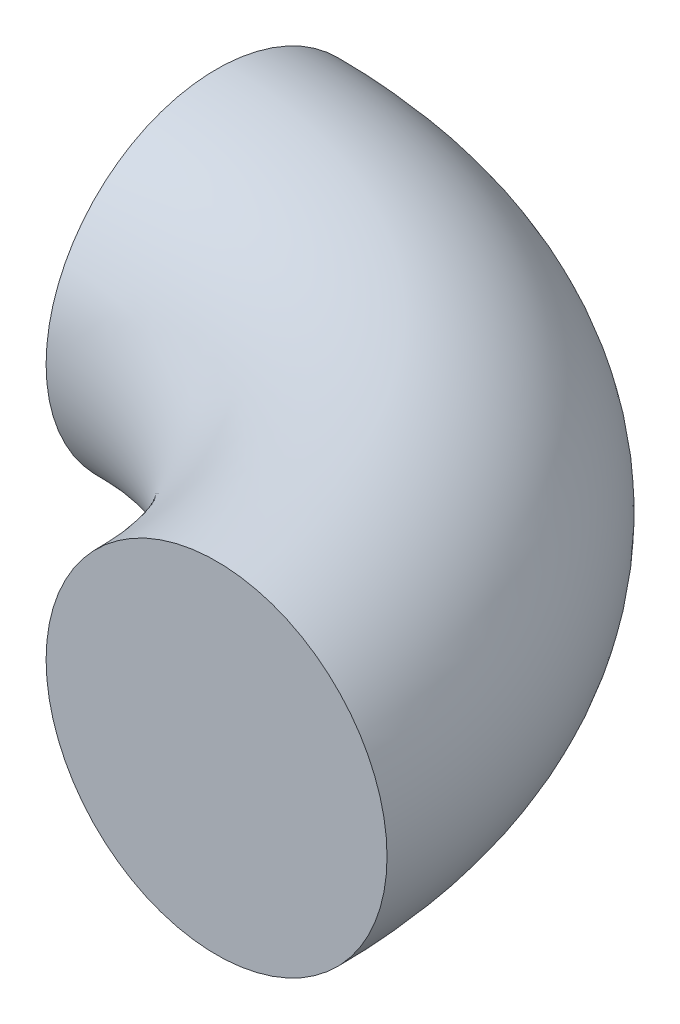
ISO-10303-21;
HEADER;
FILE_DESCRIPTION(('STEP AP214'),'2;1');
FILE_NAME('part.step','',(''),(''),'','','');
FILE_SCHEMA(('AUTOMOTIVE_DESIGN { 1 0 10303 214 1 1 1 1 }'));
ENDSEC;
DATA;
#1=APPLICATION_CONTEXT('core data for automotive mechanical design processes');
#2=APPLICATION_PROTOCOL_DEFINITION('international standard','automotive_design',2000,#1);
#3=PRODUCT_CONTEXT('',#1,'mechanical');
#4=PRODUCT('Part','Part','',(#3));
#5=PRODUCT_RELATED_PRODUCT_CATEGORY('part','',(#4));
#6=PRODUCT_DEFINITION_FORMATION('','',#4);
#7=PRODUCT_DEFINITION_CONTEXT('part definition',#1,'design');
#8=PRODUCT_DEFINITION('design','',#6,#7);
#9=PRODUCT_DEFINITION_SHAPE('','',#8);
#10=(LENGTH_UNIT() NAMED_UNIT(*) SI_UNIT(.MILLI.,.METRE.));
#11=(NAMED_UNIT(*) PLANE_ANGLE_UNIT() SI_UNIT($,.RADIAN.));
#12=(NAMED_UNIT(*) SI_UNIT($,.STERADIAN.) SOLID_ANGLE_UNIT());
#13=UNCERTAINTY_MEASURE_WITH_UNIT(LENGTH_MEASURE(1.E-05),#10,'distance_accuracy_value','');
#14=(GEOMETRIC_REPRESENTATION_CONTEXT(3) GLOBAL_UNCERTAINTY_ASSIGNED_CONTEXT((#13)) GLOBAL_UNIT_ASSIGNED_CONTEXT((#10,
#11,#12)) REPRESENTATION_CONTEXT('',''));
#15=CARTESIAN_POINT('',(0.,0.,0.));
#16=DIRECTION('',(0.,0.,1.));
#17=DIRECTION('',(1.,0.,0.));
#18=AXIS2_PLACEMENT_3D('',#15,#16,#17);
#19=CARTESIAN_POINT('',(0.,0.,0.));
#20=DIRECTION('',(0.,-1.,0.));
#21=DIRECTION('',(0.,0.,-1.));
#22=AXIS2_PLACEMENT_3D('',#19,#20,#21);
#23=TOROIDAL_SURFACE('',#22,5.,2.);
#24=CARTESIAN_POINT('',(0.,0.,-5.));
#25=DIRECTION('',(1.,0.,0.));
#26=DIRECTION('',(0.,0.,-1.));
#27=AXIS2_PLACEMENT_3D('',#24,#25,#26);
#28=CIRCLE('',#27,2.);
#29=CARTESIAN_POINT('',(0.,0.,-7.));
#30=VERTEX_POINT('',#29);
#31=EDGE_CURVE('E10',#30,#30,#28,.T.);
#32=CARTESIAN_POINT('',(5.,0.,0.));
#33=DIRECTION('',(0.,0.,1.));
#34=DIRECTION('',(1.,0.,0.));
#35=AXIS2_PLACEMENT_3D('',#32,#33,#34);
#36=CIRCLE('',#35,2.);
#37=CARTESIAN_POINT('',(7.,0.,0.));
#38=VERTEX_POINT('',#37);
#39=EDGE_CURVE('E39',#38,#38,#36,.T.);
#40=CARTESIAN_POINT('',(0.,0.,0.));
#41=DIRECTION('',(0.,-1.,0.));
#42=DIRECTION('',(0.,0.,-1.));
#43=AXIS2_PLACEMENT_3D('',#40,#41,#42);
#44=CIRCLE('',#43,7.);
#45=EDGE_CURVE('',#30,#38,#44,.T.);
#46=ORIENTED_EDGE('',*,*,#31,.T.);
#47=ORIENTED_EDGE('',*,*,#39,.F.);
#48=ORIENTED_EDGE('',*,*,#45,.T.);
#49=ORIENTED_EDGE('',*,*,#45,.F.);
#50=EDGE_LOOP('',(#46,#48,#47,#49));
#51=FACE_BOUND('',#50,.T.);
#52=ADVANCED_FACE('F33',(#51),#23,.T.);
#53=CARTESIAN_POINT('',(0.,0.,-5.));
#54=DIRECTION('',(1.,0.,0.));
#55=DIRECTION('',(0.,0.,-1.));
#56=AXIS2_PLACEMENT_3D('',#53,#54,#55);
#57=PLANE('',#56);
#58=ORIENTED_EDGE('',*,*,#31,.F.);
#59=EDGE_LOOP('',(#58));
#60=FACE_BOUND('',#59,.T.);
#61=ADVANCED_FACE('F48',(#60),#57,.F.);
#62=CARTESIAN_POINT('',(5.,0.,0.));
#63=DIRECTION('',(0.,0.,1.));
#64=DIRECTION('',(1.,0.,0.));
#65=AXIS2_PLACEMENT_3D('',#62,#63,#64);
#66=PLANE('',#65);
#67=ORIENTED_EDGE('',*,*,#39,.T.);
#68=EDGE_LOOP('',(#67));
#69=FACE_BOUND('',#68,.T.);
#70=ADVANCED_FACE('F45',(#69),#66,.T.);
#71=CLOSED_SHELL('',(#52,#61,#70));
#72=MANIFOLD_SOLID_BREP('B2',#71);
#73=ADVANCED_BREP_SHAPE_REPRESENTATION('',(#18,#72),#14);
#74=SHAPE_DEFINITION_REPRESENTATION(#9,#73);
ENDSEC;
END-ISO-10303-21;
